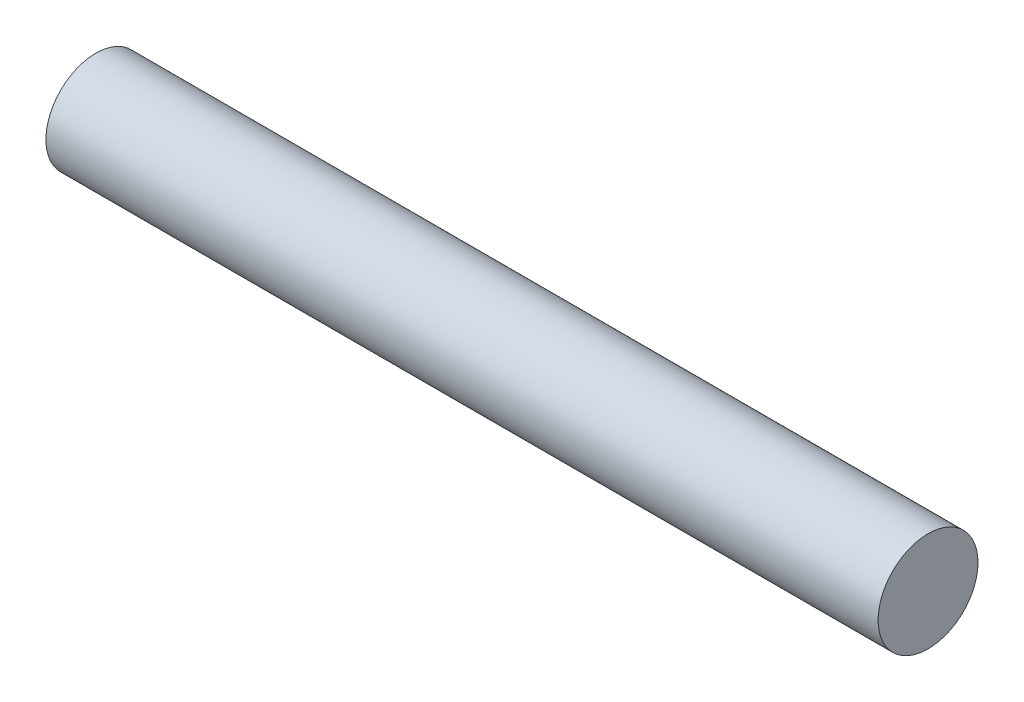
ISO-10303-21;
HEADER;
FILE_DESCRIPTION(('STEP AP214'),'2;1');
FILE_NAME('part.step','',(''),(''),'','','');
FILE_SCHEMA(('AUTOMOTIVE_DESIGN { 1 0 10303 214 1 1 1 1 }'));
ENDSEC;
DATA;
#1=APPLICATION_CONTEXT('core data for automotive mechanical design processes');
#2=APPLICATION_PROTOCOL_DEFINITION('international standard','automotive_design',2000,#1);
#3=PRODUCT_CONTEXT('',#1,'mechanical');
#4=PRODUCT('Part','Part','',(#3));
#5=PRODUCT_RELATED_PRODUCT_CATEGORY('part','',(#4));
#6=PRODUCT_DEFINITION_FORMATION('','',#4);
#7=PRODUCT_DEFINITION_CONTEXT('part definition',#1,'design');
#8=PRODUCT_DEFINITION('design','',#6,#7);
#9=PRODUCT_DEFINITION_SHAPE('','',#8);
#10=(LENGTH_UNIT() NAMED_UNIT(*) SI_UNIT(.MILLI.,.METRE.));
#11=(NAMED_UNIT(*) PLANE_ANGLE_UNIT() SI_UNIT($,.RADIAN.));
#12=(NAMED_UNIT(*) SI_UNIT($,.STERADIAN.) SOLID_ANGLE_UNIT());
#13=UNCERTAINTY_MEASURE_WITH_UNIT(LENGTH_MEASURE(1.E-05),#10,'distance_accuracy_value','');
#14=(GEOMETRIC_REPRESENTATION_CONTEXT(3) GLOBAL_UNCERTAINTY_ASSIGNED_CONTEXT((#13)) GLOBAL_UNIT_ASSIGNED_CONTEXT((#10,
#11,#12)) REPRESENTATION_CONTEXT('',''));
#15=CARTESIAN_POINT('',(0.,0.,0.));
#16=DIRECTION('',(0.,0.,1.));
#17=DIRECTION('',(1.,0.,0.));
#18=AXIS2_PLACEMENT_3D('',#15,#16,#17);
#19=CARTESIAN_POINT('',(6.25,0.,0.));
#20=DIRECTION('',(-1.,0.,0.));
#21=DIRECTION('',(0.,0.,1.));
#22=AXIS2_PLACEMENT_3D('',#19,#20,#21);
#23=CYLINDRICAL_SURFACE('',#22,0.75);
#24=CARTESIAN_POINT('',(6.25,0.,0.));
#25=DIRECTION('',(1.,0.,0.));
#26=DIRECTION('',(0.,0.,-1.));
#27=AXIS2_PLACEMENT_3D('',#24,#25,#26);
#28=CIRCLE('',#27,0.75);
#29=CARTESIAN_POINT('',(6.25,0.,-0.75));
#30=VERTEX_POINT('',#29);
#31=EDGE_CURVE('E10',#30,#30,#28,.T.);
#32=ORIENTED_EDGE('',*,*,#31,.F.);
#33=EDGE_LOOP('',(#32));
#34=FACE_BOUND('',#33,.T.);
#35=CARTESIAN_POINT('',(-6.25,0.,0.));
#36=DIRECTION('',(1.,0.,0.));
#37=DIRECTION('',(0.,0.,-1.));
#38=AXIS2_PLACEMENT_3D('',#35,#36,#37);
#39=CIRCLE('',#38,0.75);
#40=CARTESIAN_POINT('',(-6.25,0.,-0.75));
#41=VERTEX_POINT('',#40);
#42=EDGE_CURVE('E34',#41,#41,#39,.T.);
#43=ORIENTED_EDGE('',*,*,#42,.T.);
#44=EDGE_LOOP('',(#43));
#45=FACE_BOUND('',#44,.T.);
#46=ADVANCED_FACE('F31',(#34,#45),#23,.T.);
#47=CARTESIAN_POINT('',(6.25,0.,0.));
#48=DIRECTION('',(1.,0.,0.));
#49=DIRECTION('',(0.,0.,-1.));
#50=AXIS2_PLACEMENT_3D('',#47,#48,#49);
#51=PLANE('',#50);
#52=ORIENTED_EDGE('',*,*,#31,.T.);
#53=EDGE_LOOP('',(#52));
#54=FACE_BOUND('',#53,.T.);
#55=ADVANCED_FACE('F46',(#54),#51,.T.);
#56=CARTESIAN_POINT('',(-6.25,0.,0.));
#57=DIRECTION('',(1.,0.,0.));
#58=DIRECTION('',(0.,0.,-1.));
#59=AXIS2_PLACEMENT_3D('',#56,#57,#58);
#60=PLANE('',#59);
#61=ORIENTED_EDGE('',*,*,#42,.F.);
#62=EDGE_LOOP('',(#61));
#63=FACE_BOUND('',#62,.T.);
#64=ADVANCED_FACE('F44',(#63),#60,.F.);
#65=CLOSED_SHELL('',(#46,#55,#64));
#66=MANIFOLD_SOLID_BREP('B2',#65);
#67=ADVANCED_BREP_SHAPE_REPRESENTATION('',(#18,#66),#14);
#68=SHAPE_DEFINITION_REPRESENTATION(#9,#67);
ENDSEC;
END-ISO-10303-21;
